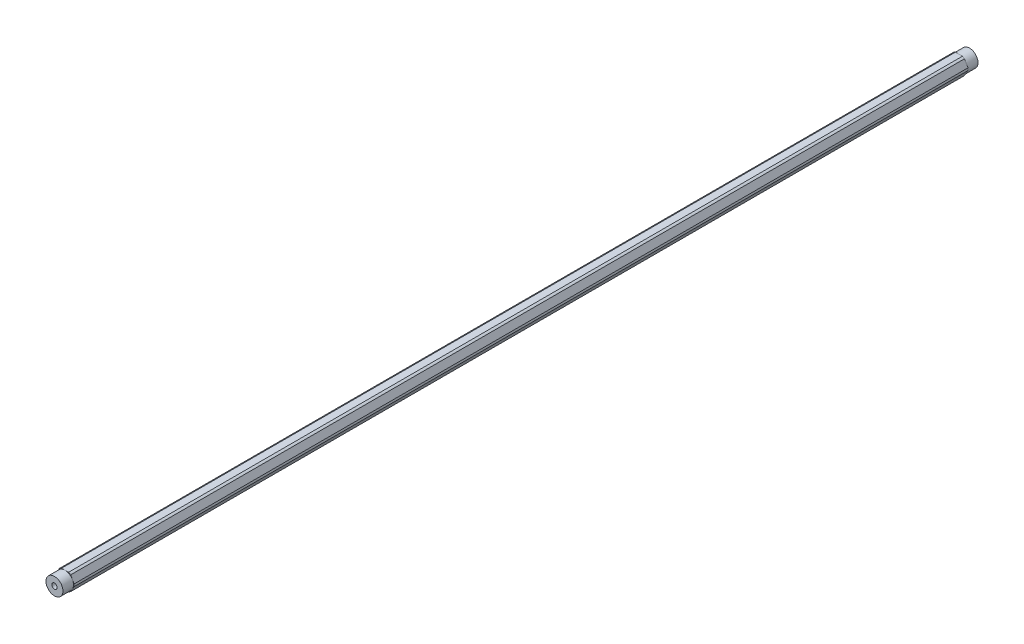
ISO-10303-21;
HEADER;
FILE_DESCRIPTION(('STEP AP214'),'2;1');
FILE_NAME('part.step','',(''),(''),'','','');
FILE_SCHEMA(('AUTOMOTIVE_DESIGN { 1 0 10303 214 1 1 1 1 }'));
ENDSEC;
DATA;
#1=APPLICATION_CONTEXT('core data for automotive mechanical design processes');
#2=APPLICATION_PROTOCOL_DEFINITION('international standard','automotive_design',2000,#1);
#3=PRODUCT_CONTEXT('',#1,'mechanical');
#4=PRODUCT('Part','Part','',(#3));
#5=PRODUCT_RELATED_PRODUCT_CATEGORY('part','',(#4));
#6=PRODUCT_DEFINITION_FORMATION('','',#4);
#7=PRODUCT_DEFINITION_CONTEXT('part definition',#1,'design');
#8=PRODUCT_DEFINITION('design','',#6,#7);
#9=PRODUCT_DEFINITION_SHAPE('','',#8);
#10=(LENGTH_UNIT() NAMED_UNIT(*) SI_UNIT(.MILLI.,.METRE.));
#11=(NAMED_UNIT(*) PLANE_ANGLE_UNIT() SI_UNIT($,.RADIAN.));
#12=(NAMED_UNIT(*) SI_UNIT($,.STERADIAN.) SOLID_ANGLE_UNIT());
#13=UNCERTAINTY_MEASURE_WITH_UNIT(LENGTH_MEASURE(1.E-05),#10,'distance_accuracy_value','');
#14=(GEOMETRIC_REPRESENTATION_CONTEXT(3) GLOBAL_UNCERTAINTY_ASSIGNED_CONTEXT((#13)) GLOBAL_UNIT_ASSIGNED_CONTEXT((#10,
#11,#12)) REPRESENTATION_CONTEXT('',''));
#15=CARTESIAN_POINT('',(0.,0.,0.));
#16=DIRECTION('',(0.,0.,1.));
#17=DIRECTION('',(1.,0.,0.));
#18=AXIS2_PLACEMENT_3D('',#15,#16,#17);
#19=CARTESIAN_POINT('',(3.66617420935409,6.34999999999998,342.9));
#20=DIRECTION('',(0.,-1.,0.));
#21=DIRECTION('',(1.,0.,0.));
#22=AXIS2_PLACEMENT_3D('',#19,#20,#21);
#23=PLANE('',#22);
#24=DIRECTION('',(1.,0.,0.));
#25=VECTOR('',#24,1.);
#26=CARTESIAN_POINT('',(3.66617420935409,6.34999999999998,-334.9498));
#27=LINE('',#26,#25);
#28=CARTESIAN_POINT('',(-2.63498102459971,6.34999999999996,-334.9498));
#29=VERTEX_POINT('',#28);
#30=CARTESIAN_POINT('',(0.,6.34999999999997,-334.9498));
#31=VERTEX_POINT('',#30);
#32=EDGE_CURVE('E215',#29,#31,#27,.T.);
#33=ORIENTED_EDGE('',*,*,#32,.F.);
#34=DIRECTION('',(0.,0.,1.));
#35=VECTOR('',#34,1.);
#36=CARTESIAN_POINT('',(-2.63498102459971,6.34999999999996,-342.9));
#37=LINE('',#36,#35);
#38=CARTESIAN_POINT('',(-2.63498102459971,6.34999999999996,334.9498));
#39=VERTEX_POINT('',#38);
#40=EDGE_CURVE('E293',#39,#29,#37,.F.);
#41=ORIENTED_EDGE('',*,*,#40,.F.);
#42=DIRECTION('',(-1.,0.,0.));
#43=VECTOR('',#42,1.);
#44=CARTESIAN_POINT('',(3.66617420935409,6.34999999999998,334.9498));
#45=LINE('',#44,#43);
#46=CARTESIAN_POINT('',(0.,6.34999999999997,334.9498));
#47=VERTEX_POINT('',#46);
#48=EDGE_CURVE('E331',#47,#39,#45,.T.);
#49=ORIENTED_EDGE('',*,*,#48,.F.);
#50=CARTESIAN_POINT('',(2.63498102459967,6.34999999999997,334.9498));
#51=VERTEX_POINT('',#50);
#52=EDGE_CURVE('E335',#51,#47,#45,.T.);
#53=ORIENTED_EDGE('',*,*,#52,.F.);
#54=DIRECTION('',(0.,0.,1.));
#55=VECTOR('',#54,1.);
#56=CARTESIAN_POINT('',(2.63498102459967,6.34999999999997,-342.9));
#57=LINE('',#56,#55);
#58=CARTESIAN_POINT('',(2.63498102459967,6.34999999999997,-334.9498));
#59=VERTEX_POINT('',#58);
#60=EDGE_CURVE('E68',#59,#51,#57,.T.);
#61=ORIENTED_EDGE('',*,*,#60,.F.);
#62=EDGE_CURVE('E62',#31,#59,#27,.T.);
#63=ORIENTED_EDGE('',*,*,#62,.F.);
#64=EDGE_LOOP('',(#33,#41,#49,#53,#61,#63));
#65=FACE_BOUND('',#64,.T.);
#66=ADVANCED_FACE('F47',(#65),#23,.F.);
#67=CARTESIAN_POINT('',(-3.66617420935414,6.34999999999995,342.9));
#68=DIRECTION('',(0.866025403784442,-0.499999999999995,0.));
#69=DIRECTION('',(0.499999999999995,0.866025403784442,0.));
#70=AXIS2_PLACEMENT_3D('',#67,#68,#69);
#71=PLANE('',#70);
#72=DIRECTION('',(0.499999999999995,0.866025403784442,0.));
#73=VECTOR('',#72,1.);
#74=CARTESIAN_POINT('',(-3.66617420935414,6.34999999999995,-334.9498));
#75=LINE('',#74,#73);
#76=CARTESIAN_POINT('',(-6.81675182633101,0.893039494206661,-334.9498));
#77=VERTEX_POINT('',#76);
#78=CARTESIAN_POINT('',(-5.49926131403117,3.17499999999995,-334.9498));
#79=VERTEX_POINT('',#78);
#80=EDGE_CURVE('E212',#77,#79,#75,.T.);
#81=ORIENTED_EDGE('',*,*,#80,.F.);
#82=DIRECTION('',(0.,0.,1.));
#83=VECTOR('',#82,1.);
#84=CARTESIAN_POINT('',(-6.81675182633101,0.89303949420666,-342.9));
#85=LINE('',#84,#83);
#86=CARTESIAN_POINT('',(-6.81675182633101,0.89303949420666,334.9498));
#87=VERTEX_POINT('',#86);
#88=EDGE_CURVE('E282',#87,#77,#85,.F.);
#89=ORIENTED_EDGE('',*,*,#88,.F.);
#90=DIRECTION('',(-0.499999999999995,-0.866025403784442,0.));
#91=VECTOR('',#90,1.);
#92=CARTESIAN_POINT('',(-3.66617420935414,6.34999999999995,334.9498));
#93=LINE('',#92,#91);
#94=CARTESIAN_POINT('',(-5.49926131403117,3.17499999999995,334.9498));
#95=VERTEX_POINT('',#94);
#96=EDGE_CURVE('E326',#95,#87,#93,.T.);
#97=ORIENTED_EDGE('',*,*,#96,.F.);
#98=CARTESIAN_POINT('',(-4.18177080173134,5.45696050579324,334.9498));
#99=VERTEX_POINT('',#98);
#100=EDGE_CURVE('E330',#99,#95,#93,.T.);
#101=ORIENTED_EDGE('',*,*,#100,.F.);
#102=DIRECTION('',(0.,0.,1.));
#103=VECTOR('',#102,1.);
#104=CARTESIAN_POINT('',(-4.18177080173134,5.45696050579324,-342.9));
#105=LINE('',#104,#103);
#106=CARTESIAN_POINT('',(-4.18177080173134,5.45696050579324,-334.9498));
#107=VERTEX_POINT('',#106);
#108=EDGE_CURVE('E290',#107,#99,#105,.T.);
#109=ORIENTED_EDGE('',*,*,#108,.F.);
#110=EDGE_CURVE('E208',#79,#107,#75,.T.);
#111=ORIENTED_EDGE('',*,*,#110,.F.);
#112=EDGE_LOOP('',(#81,#89,#97,#101,#109,#111));
#113=FACE_BOUND('',#112,.T.);
#114=ADVANCED_FACE('F404',(#113),#71,.F.);
#115=CARTESIAN_POINT('',(-7.33234841870821,0.,342.9));
#116=DIRECTION('',(0.866025403784434,0.500000000000007,0.));
#117=DIRECTION('',(-0.500000000000007,0.866025403784435,0.));
#118=AXIS2_PLACEMENT_3D('',#115,#116,#117);
#119=PLANE('',#118);
#120=DIRECTION('',(-0.500000000000007,0.866025403784435,0.));
#121=VECTOR('',#120,1.);
#122=CARTESIAN_POINT('',(-7.33234841870821,0.,-334.9498));
#123=LINE('',#122,#121);
#124=CARTESIAN_POINT('',(-4.18177080173127,-5.4569605057933,-334.9498));
#125=VERTEX_POINT('',#124);
#126=CARTESIAN_POINT('',(-5.49926131403113,-3.17500000000003,-334.9498));
#127=VERTEX_POINT('',#126);
#128=EDGE_CURVE('E234',#125,#127,#123,.T.);
#129=ORIENTED_EDGE('',*,*,#128,.F.);
#130=DIRECTION('',(0.,0.,1.));
#131=VECTOR('',#130,1.);
#132=CARTESIAN_POINT('',(-4.18177080173126,-5.4569605057933,-342.9));
#133=LINE('',#132,#131);
#134=CARTESIAN_POINT('',(-4.18177080173127,-5.4569605057933,334.9498));
#135=VERTEX_POINT('',#134);
#136=EDGE_CURVE('E271',#135,#125,#133,.F.);
#137=ORIENTED_EDGE('',*,*,#136,.F.);
#138=DIRECTION('',(0.500000000000007,-0.866025403784435,0.));
#139=VECTOR('',#138,1.);
#140=CARTESIAN_POINT('',(-7.33234841870821,0.,334.9498));
#141=LINE('',#140,#139);
#142=CARTESIAN_POINT('',(-5.49926131403113,-3.17500000000003,334.9498));
#143=VERTEX_POINT('',#142);
#144=EDGE_CURVE('E321',#143,#135,#141,.T.);
#145=ORIENTED_EDGE('',*,*,#144,.F.);
#146=CARTESIAN_POINT('',(-6.81675182633099,-0.893039494206761,334.9498));
#147=VERTEX_POINT('',#146);
#148=EDGE_CURVE('E325',#147,#143,#141,.T.);
#149=ORIENTED_EDGE('',*,*,#148,.F.);
#150=DIRECTION('',(0.,0.,1.));
#151=VECTOR('',#150,1.);
#152=CARTESIAN_POINT('',(-6.81675182633099,-0.893039494206754,-342.9));
#153=LINE('',#152,#151);
#154=CARTESIAN_POINT('',(-6.81675182633099,-0.893039494206759,-334.9498));
#155=VERTEX_POINT('',#154);
#156=EDGE_CURVE('E279',#155,#147,#153,.T.);
#157=ORIENTED_EDGE('',*,*,#156,.F.);
#158=EDGE_CURVE('E230',#127,#155,#123,.T.);
#159=ORIENTED_EDGE('',*,*,#158,.F.);
#160=EDGE_LOOP('',(#129,#137,#145,#149,#157,#159));
#161=FACE_BOUND('',#160,.T.);
#162=ADVANCED_FACE('F456',(#161),#119,.F.);
#163=CARTESIAN_POINT('',(-3.66617420935405,-6.35,342.9));
#164=DIRECTION('',(0.,1.,0.));
#165=DIRECTION('',(-1.,0.,0.));
#166=AXIS2_PLACEMENT_3D('',#163,#164,#165);
#167=PLANE('',#166);
#168=DIRECTION('',(-1.,0.,0.));
#169=VECTOR('',#168,1.);
#170=CARTESIAN_POINT('',(-3.66617420935405,-6.35,-334.9498));
#171=LINE('',#170,#169);
#172=CARTESIAN_POINT('',(2.63498102459976,-6.34999999999994,-334.9498));
#173=VERTEX_POINT('',#172);
#174=CARTESIAN_POINT('',(0.,-6.34999999999997,-334.9498));
#175=VERTEX_POINT('',#174);
#176=EDGE_CURVE('E242',#173,#175,#171,.T.);
#177=ORIENTED_EDGE('',*,*,#176,.F.);
#178=DIRECTION('',(0.,0.,1.));
#179=VECTOR('',#178,1.);
#180=CARTESIAN_POINT('',(2.63498102459976,-6.34999999999994,-342.9));
#181=LINE('',#180,#179);
#182=CARTESIAN_POINT('',(2.63498102459976,-6.34999999999994,334.9498));
#183=VERTEX_POINT('',#182);
#184=EDGE_CURVE('E260',#183,#173,#181,.F.);
#185=ORIENTED_EDGE('',*,*,#184,.F.);
#186=DIRECTION('',(1.,0.,0.));
#187=VECTOR('',#186,1.);
#188=CARTESIAN_POINT('',(-3.66617420935405,-6.35,334.9498));
#189=LINE('',#188,#187);
#190=CARTESIAN_POINT('',(0.,-6.34999999999997,334.9498));
#191=VERTEX_POINT('',#190);
#192=EDGE_CURVE('E316',#191,#183,#189,.T.);
#193=ORIENTED_EDGE('',*,*,#192,.F.);
#194=CARTESIAN_POINT('',(-2.63498102459963,-6.34999999999999,334.9498));
#195=VERTEX_POINT('',#194);
#196=EDGE_CURVE('E320',#195,#191,#189,.T.);
#197=ORIENTED_EDGE('',*,*,#196,.F.);
#198=DIRECTION('',(0.,0.,1.));
#199=VECTOR('',#198,1.);
#200=CARTESIAN_POINT('',(-2.63498102459963,-6.34999999999999,-342.9));
#201=LINE('',#200,#199);
#202=CARTESIAN_POINT('',(-2.63498102459963,-6.34999999999999,-334.9498));
#203=VERTEX_POINT('',#202);
#204=EDGE_CURVE('E268',#203,#195,#201,.T.);
#205=ORIENTED_EDGE('',*,*,#204,.F.);
#206=EDGE_CURVE('E239',#175,#203,#171,.T.);
#207=ORIENTED_EDGE('',*,*,#206,.F.);
#208=EDGE_LOOP('',(#177,#185,#193,#197,#205,#207));
#209=FACE_BOUND('',#208,.T.);
#210=ADVANCED_FACE('F426',(#209),#167,.F.);
#211=CARTESIAN_POINT('',(3.66617420935418,-6.34999999999993,342.9));
#212=DIRECTION('',(-0.866025403784441,0.499999999999995,0.));
#213=DIRECTION('',(-0.499999999999995,-0.866025403784441,0.));
#214=AXIS2_PLACEMENT_3D('',#211,#212,#213);
#215=PLANE('',#214);
#216=DIRECTION('',(-0.499999999999995,-0.866025403784441,0.));
#217=VECTOR('',#216,1.);
#218=CARTESIAN_POINT('',(3.66617420935418,-6.34999999999993,-334.9498));
#219=LINE('',#218,#217);
#220=CARTESIAN_POINT('',(6.816751826331,-0.893039494206728,-334.9498));
#221=VERTEX_POINT('',#220);
#222=CARTESIAN_POINT('',(5.49926131403117,-3.17499999999995,-334.9498));
#223=VERTEX_POINT('',#222);
#224=EDGE_CURVE('E188',#221,#223,#219,.T.);
#225=ORIENTED_EDGE('',*,*,#224,.F.);
#226=DIRECTION('',(0.,0.,1.));
#227=VECTOR('',#226,1.);
#228=CARTESIAN_POINT('',(6.816751826331,-0.893039494206728,-342.9));
#229=LINE('',#228,#227);
#230=CARTESIAN_POINT('',(6.816751826331,-0.893039494206728,334.9498));
#231=VERTEX_POINT('',#230);
#232=EDGE_CURVE('E249',#231,#221,#229,.F.);
#233=ORIENTED_EDGE('',*,*,#232,.F.);
#234=DIRECTION('',(0.499999999999995,0.866025403784441,0.));
#235=VECTOR('',#234,1.);
#236=CARTESIAN_POINT('',(3.66617420935418,-6.34999999999993,334.9498));
#237=LINE('',#236,#235);
#238=CARTESIAN_POINT('',(5.49926131403117,-3.17499999999995,334.9498));
#239=VERTEX_POINT('',#238);
#240=EDGE_CURVE('E310',#239,#231,#237,.T.);
#241=ORIENTED_EDGE('',*,*,#240,.F.);
#242=CARTESIAN_POINT('',(4.18177080173139,-5.4569605057932,334.9498));
#243=VERTEX_POINT('',#242);
#244=EDGE_CURVE('E315',#243,#239,#237,.T.);
#245=ORIENTED_EDGE('',*,*,#244,.F.);
#246=DIRECTION('',(0.,0.,1.));
#247=VECTOR('',#246,1.);
#248=CARTESIAN_POINT('',(4.18177080173139,-5.4569605057932,-342.9));
#249=LINE('',#248,#247);
#250=CARTESIAN_POINT('',(4.18177080173139,-5.4569605057932,-334.9498));
#251=VERTEX_POINT('',#250);
#252=EDGE_CURVE('E257',#251,#243,#249,.T.);
#253=ORIENTED_EDGE('',*,*,#252,.F.);
#254=EDGE_CURVE('E231',#223,#251,#219,.T.);
#255=ORIENTED_EDGE('',*,*,#254,.F.);
#256=EDGE_LOOP('',(#225,#233,#241,#245,#253,#255));
#257=FACE_BOUND('',#256,.T.);
#258=ADVANCED_FACE('F433',(#257),#215,.F.);
#259=CARTESIAN_POINT('',(7.33234841870821,0.,342.9));
#260=DIRECTION('',(-0.866025403784438,-0.500000000000001,0.));
#261=DIRECTION('',(0.500000000000001,-0.866025403784438,0.));
#262=AXIS2_PLACEMENT_3D('',#259,#260,#261);
#263=PLANE('',#262);
#264=DIRECTION('',(0.500000000000001,-0.866025403784438,0.));
#265=VECTOR('',#264,1.);
#266=CARTESIAN_POINT('',(7.33234841870821,0.,-334.9498));
#267=LINE('',#266,#265);
#268=CARTESIAN_POINT('',(4.1817708017313,5.45696050579327,-334.9498));
#269=VERTEX_POINT('',#268);
#270=CARTESIAN_POINT('',(5.49926131403115,3.17499999999999,-334.9498));
#271=VERTEX_POINT('',#270);
#272=EDGE_CURVE('E170',#269,#271,#267,.T.);
#273=ORIENTED_EDGE('',*,*,#272,.F.);
#274=DIRECTION('',(0.,0.,1.));
#275=VECTOR('',#274,1.);
#276=CARTESIAN_POINT('',(4.1817708017313,5.45696050579327,-342.9));
#277=LINE('',#276,#275);
#278=CARTESIAN_POINT('',(4.18177080173131,5.45696050579327,334.9498));
#279=VERTEX_POINT('',#278);
#280=EDGE_CURVE('E300',#279,#269,#277,.F.);
#281=ORIENTED_EDGE('',*,*,#280,.F.);
#282=DIRECTION('',(-0.500000000000001,0.866025403784438,0.));
#283=VECTOR('',#282,1.);
#284=CARTESIAN_POINT('',(7.33234841870821,0.,334.9498));
#285=LINE('',#284,#283);
#286=CARTESIAN_POINT('',(5.49926131403115,3.17499999999999,334.9498));
#287=VERTEX_POINT('',#286);
#288=EDGE_CURVE('E340',#287,#279,#285,.T.);
#289=ORIENTED_EDGE('',*,*,#288,.F.);
#290=CARTESIAN_POINT('',(6.816751826331,0.893039494206714,334.9498));
#291=VERTEX_POINT('',#290);
#292=EDGE_CURVE('E343',#291,#287,#285,.T.);
#293=ORIENTED_EDGE('',*,*,#292,.F.);
#294=DIRECTION('',(0.,0.,1.));
#295=VECTOR('',#294,1.);
#296=CARTESIAN_POINT('',(6.816751826331,0.89303949420671,-342.9));
#297=LINE('',#296,#295);
#298=CARTESIAN_POINT('',(6.816751826331,0.89303949420671,-334.9498));
#299=VERTEX_POINT('',#298);
#300=EDGE_CURVE('E206',#299,#291,#297,.T.);
#301=ORIENTED_EDGE('',*,*,#300,.F.);
#302=EDGE_CURVE('E181',#271,#299,#267,.T.);
#303=ORIENTED_EDGE('',*,*,#302,.F.);
#304=EDGE_LOOP('',(#273,#281,#289,#293,#301,#303));
#305=FACE_BOUND('',#304,.T.);
#306=ADVANCED_FACE('F204',(#305),#263,.F.);
#307=CARTESIAN_POINT('',(0.,0.,-342.9));
#308=DIRECTION('',(0.,0.,1.));
#309=DIRECTION('',(1.,0.,0.));
#310=AXIS2_PLACEMENT_3D('',#307,#308,#309);
#311=CYLINDRICAL_SURFACE('',#310,6.875);
#312=ORIENTED_EDGE('',*,*,#232,.T.);
#313=CARTESIAN_POINT('',(0.,0.,-334.9498));
#314=DIRECTION('',(0.,0.,-1.));
#315=DIRECTION('',(-1.,0.,0.));
#316=AXIS2_PLACEMENT_3D('',#313,#314,#315);
#317=CIRCLE('',#316,6.875);
#318=EDGE_CURVE('E225',#221,#299,#317,.F.);
#319=ORIENTED_EDGE('',*,*,#318,.T.);
#320=ORIENTED_EDGE('',*,*,#300,.T.);
#321=CARTESIAN_POINT('',(0.,0.,334.9498));
#322=DIRECTION('',(0.,0.,1.));
#323=DIRECTION('',(1.,0.,0.));
#324=AXIS2_PLACEMENT_3D('',#321,#322,#323);
#325=CIRCLE('',#324,6.875);
#326=EDGE_CURVE('E55',#231,#291,#325,.T.);
#327=ORIENTED_EDGE('',*,*,#326,.F.);
#328=EDGE_LOOP('',(#312,#319,#320,#327));
#329=FACE_BOUND('',#328,.T.);
#330=ADVANCED_FACE('F437',(#329),#311,.T.);
#331=ORIENTED_EDGE('',*,*,#184,.T.);
#332=CARTESIAN_POINT('',(0.,0.,-334.9498));
#333=DIRECTION('',(0.,0.,-1.));
#334=DIRECTION('',(-1.,0.,0.));
#335=AXIS2_PLACEMENT_3D('',#332,#333,#334);
#336=CIRCLE('',#335,6.875);
#337=EDGE_CURVE('E243',#173,#251,#336,.F.);
#338=ORIENTED_EDGE('',*,*,#337,.T.);
#339=ORIENTED_EDGE('',*,*,#252,.T.);
#340=CARTESIAN_POINT('',(0.,0.,334.9498));
#341=DIRECTION('',(0.,0.,1.));
#342=DIRECTION('',(1.,0.,0.));
#343=AXIS2_PLACEMENT_3D('',#340,#341,#342);
#344=CIRCLE('',#343,6.875);
#345=EDGE_CURVE('E253',#183,#243,#344,.T.);
#346=ORIENTED_EDGE('',*,*,#345,.F.);
#347=EDGE_LOOP('',(#331,#338,#339,#346));
#348=FACE_BOUND('',#347,.T.);
#349=ADVANCED_FACE('F439',(#348),#311,.T.);
#350=ORIENTED_EDGE('',*,*,#136,.T.);
#351=CARTESIAN_POINT('',(0.,0.,-334.9498));
#352=DIRECTION('',(0.,0.,-1.));
#353=DIRECTION('',(-1.,0.,0.));
#354=AXIS2_PLACEMENT_3D('',#351,#352,#353);
#355=CIRCLE('',#354,6.875);
#356=EDGE_CURVE('E235',#125,#203,#355,.F.);
#357=ORIENTED_EDGE('',*,*,#356,.T.);
#358=ORIENTED_EDGE('',*,*,#204,.T.);
#359=CARTESIAN_POINT('',(0.,0.,334.9498));
#360=DIRECTION('',(0.,0.,1.));
#361=DIRECTION('',(1.,0.,0.));
#362=AXIS2_PLACEMENT_3D('',#359,#360,#361);
#363=CIRCLE('',#362,6.875);
#364=EDGE_CURVE('E264',#135,#195,#363,.T.);
#365=ORIENTED_EDGE('',*,*,#364,.F.);
#366=EDGE_LOOP('',(#350,#357,#358,#365));
#367=FACE_BOUND('',#366,.T.);
#368=ADVANCED_FACE('F445',(#367),#311,.T.);
#369=ORIENTED_EDGE('',*,*,#88,.T.);
#370=CARTESIAN_POINT('',(0.,0.,-334.9498));
#371=DIRECTION('',(0.,0.,-1.));
#372=DIRECTION('',(-1.,0.,0.));
#373=AXIS2_PLACEMENT_3D('',#370,#371,#372);
#374=CIRCLE('',#373,6.875);
#375=EDGE_CURVE('E221',#77,#155,#374,.F.);
#376=ORIENTED_EDGE('',*,*,#375,.T.);
#377=ORIENTED_EDGE('',*,*,#156,.T.);
#378=CARTESIAN_POINT('',(0.,0.,334.9498));
#379=DIRECTION('',(0.,0.,1.));
#380=DIRECTION('',(1.,0.,0.));
#381=AXIS2_PLACEMENT_3D('',#378,#379,#380);
#382=CIRCLE('',#381,6.875);
#383=EDGE_CURVE('E275',#87,#147,#382,.T.);
#384=ORIENTED_EDGE('',*,*,#383,.F.);
#385=EDGE_LOOP('',(#369,#376,#377,#384));
#386=FACE_BOUND('',#385,.T.);
#387=ADVANCED_FACE('F517',(#386),#311,.T.);
#388=ORIENTED_EDGE('',*,*,#40,.T.);
#389=CARTESIAN_POINT('',(0.,0.,-334.9498));
#390=DIRECTION('',(0.,0.,-1.));
#391=DIRECTION('',(-1.,0.,0.));
#392=AXIS2_PLACEMENT_3D('',#389,#390,#391);
#393=CIRCLE('',#392,6.875);
#394=EDGE_CURVE('E209',#29,#107,#393,.F.);
#395=ORIENTED_EDGE('',*,*,#394,.T.);
#396=ORIENTED_EDGE('',*,*,#108,.T.);
#397=CARTESIAN_POINT('',(0.,0.,334.9498));
#398=DIRECTION('',(0.,0.,1.));
#399=DIRECTION('',(1.,0.,0.));
#400=AXIS2_PLACEMENT_3D('',#397,#398,#399);
#401=CIRCLE('',#400,6.875);
#402=EDGE_CURVE('E286',#39,#99,#401,.T.);
#403=ORIENTED_EDGE('',*,*,#402,.F.);
#404=EDGE_LOOP('',(#388,#395,#396,#403));
#405=FACE_BOUND('',#404,.T.);
#406=ADVANCED_FACE('F408',(#405),#311,.T.);
#407=ORIENTED_EDGE('',*,*,#280,.T.);
#408=CARTESIAN_POINT('',(0.,0.,-334.9498));
#409=DIRECTION('',(0.,0.,-1.));
#410=DIRECTION('',(-1.,0.,0.));
#411=AXIS2_PLACEMENT_3D('',#408,#409,#410);
#412=CIRCLE('',#411,6.875);
#413=EDGE_CURVE('E12',#269,#59,#412,.F.);
#414=ORIENTED_EDGE('',*,*,#413,.T.);
#415=ORIENTED_EDGE('',*,*,#60,.T.);
#416=CARTESIAN_POINT('',(0.,0.,334.9498));
#417=DIRECTION('',(0.,0.,1.));
#418=DIRECTION('',(1.,0.,0.));
#419=AXIS2_PLACEMENT_3D('',#416,#417,#418);
#420=CIRCLE('',#419,6.875);
#421=EDGE_CURVE('E297',#279,#51,#420,.T.);
#422=ORIENTED_EDGE('',*,*,#421,.F.);
#423=EDGE_LOOP('',(#407,#414,#415,#422));
#424=FACE_BOUND('',#423,.T.);
#425=ADVANCED_FACE('F367',(#424),#311,.T.);
#426=CARTESIAN_POINT('',(0.,0.,334.9498));
#427=DIRECTION('',(0.,0.,1.));
#428=DIRECTION('',(1.,0.,0.));
#429=AXIS2_PLACEMENT_3D('',#426,#427,#428);
#430=PLANE('',#429);
#431=ORIENTED_EDGE('',*,*,#288,.T.);
#432=ORIENTED_EDGE('',*,*,#421,.T.);
#433=ORIENTED_EDGE('',*,*,#52,.T.);
#434=CARTESIAN_POINT('',(0.,0.,334.9498));
#435=DIRECTION('',(0.,0.,1.));
#436=DIRECTION('',(1.,0.,0.));
#437=AXIS2_PLACEMENT_3D('',#434,#435,#436);
#438=CIRCLE('',#437,6.34999999999997);
#439=EDGE_CURVE('E306',#287,#47,#438,.T.);
#440=ORIENTED_EDGE('',*,*,#439,.F.);
#441=EDGE_LOOP('',(#431,#432,#433,#440));
#442=FACE_BOUND('',#441,.T.);
#443=ADVANCED_FACE('F355',(#442),#430,.T.);
#444=ORIENTED_EDGE('',*,*,#48,.T.);
#445=ORIENTED_EDGE('',*,*,#402,.T.);
#446=ORIENTED_EDGE('',*,*,#100,.T.);
#447=EDGE_CURVE('E311',#47,#95,#438,.T.);
#448=ORIENTED_EDGE('',*,*,#447,.F.);
#449=EDGE_LOOP('',(#444,#445,#446,#448));
#450=FACE_BOUND('',#449,.T.);
#451=ADVANCED_FACE('F410',(#450),#430,.T.);
#452=ORIENTED_EDGE('',*,*,#96,.T.);
#453=ORIENTED_EDGE('',*,*,#383,.T.);
#454=ORIENTED_EDGE('',*,*,#148,.T.);
#455=EDGE_CURVE('E378',#95,#143,#438,.T.);
#456=ORIENTED_EDGE('',*,*,#455,.F.);
#457=EDGE_LOOP('',(#452,#453,#454,#456));
#458=FACE_BOUND('',#457,.T.);
#459=ADVANCED_FACE('F414',(#458),#430,.T.);
#460=ORIENTED_EDGE('',*,*,#144,.T.);
#461=ORIENTED_EDGE('',*,*,#364,.T.);
#462=ORIENTED_EDGE('',*,*,#196,.T.);
#463=EDGE_CURVE('E381',#143,#191,#438,.T.);
#464=ORIENTED_EDGE('',*,*,#463,.F.);
#465=EDGE_LOOP('',(#460,#461,#462,#464));
#466=FACE_BOUND('',#465,.T.);
#467=ADVANCED_FACE('F420',(#466),#430,.T.);
#468=ORIENTED_EDGE('',*,*,#192,.T.);
#469=ORIENTED_EDGE('',*,*,#345,.T.);
#470=ORIENTED_EDGE('',*,*,#244,.T.);
#471=EDGE_CURVE('E364',#191,#239,#438,.T.);
#472=ORIENTED_EDGE('',*,*,#471,.F.);
#473=EDGE_LOOP('',(#468,#469,#470,#472));
#474=FACE_BOUND('',#473,.T.);
#475=ADVANCED_FACE('F429',(#474),#430,.T.);
#476=ORIENTED_EDGE('',*,*,#240,.T.);
#477=ORIENTED_EDGE('',*,*,#326,.T.);
#478=ORIENTED_EDGE('',*,*,#292,.T.);
#479=EDGE_CURVE('E305',#239,#287,#438,.T.);
#480=ORIENTED_EDGE('',*,*,#479,.F.);
#481=EDGE_LOOP('',(#476,#477,#478,#480));
#482=FACE_BOUND('',#481,.T.);
#483=ADVANCED_FACE('F350',(#482),#430,.T.);
#484=CARTESIAN_POINT('',(0.,0.,334.9498));
#485=DIRECTION('',(0.,0.,1.));
#486=DIRECTION('',(1.,0.,0.));
#487=AXIS2_PLACEMENT_3D('',#484,#485,#486);
#488=CYLINDRICAL_SURFACE('',#487,6.34999999999997);
#489=CARTESIAN_POINT('',(0.,0.,342.9));
#490=DIRECTION('',(0.,0.,1.));
#491=DIRECTION('',(1.,0.,0.));
#492=AXIS2_PLACEMENT_3D('',#489,#490,#491);
#493=CIRCLE('',#492,6.34999999999997);
#494=CARTESIAN_POINT('',(6.34999999999997,0.,342.9));
#495=VERTEX_POINT('',#494);
#496=EDGE_CURVE('E336',#495,#495,#493,.T.);
#497=ORIENTED_EDGE('',*,*,#496,.F.);
#498=EDGE_LOOP('',(#497));
#499=FACE_BOUND('',#498,.T.);
#500=ORIENTED_EDGE('',*,*,#439,.T.);
#501=ORIENTED_EDGE('',*,*,#447,.T.);
#502=ORIENTED_EDGE('',*,*,#455,.T.);
#503=ORIENTED_EDGE('',*,*,#463,.T.);
#504=ORIENTED_EDGE('',*,*,#471,.T.);
#505=ORIENTED_EDGE('',*,*,#479,.T.);
#506=EDGE_LOOP('',(#500,#501,#502,#503,#504,#505));
#507=FACE_BOUND('',#506,.T.);
#508=ADVANCED_FACE('F361',(#499,#507),#488,.T.);
#509=CARTESIAN_POINT('',(0.,0.,342.9));
#510=DIRECTION('',(0.,0.,1.));
#511=DIRECTION('',(1.,0.,0.));
#512=AXIS2_PLACEMENT_3D('',#509,#510,#511);
#513=PLANE('',#512);
#514=CARTESIAN_POINT('',(0.,0.,342.9));
#515=DIRECTION('',(0.,0.,1.));
#516=DIRECTION('',(1.,0.,0.));
#517=AXIS2_PLACEMENT_3D('',#514,#515,#516);
#518=CIRCLE('',#517,2.0193);
#519=CARTESIAN_POINT('',(2.0193,0.,342.9));
#520=VERTEX_POINT('',#519);
#521=EDGE_CURVE('E675',#520,#520,#518,.T.);
#522=ORIENTED_EDGE('',*,*,#521,.F.);
#523=EDGE_LOOP('',(#522));
#524=FACE_BOUND('',#523,.T.);
#525=ORIENTED_EDGE('',*,*,#496,.T.);
#526=EDGE_LOOP('',(#525));
#527=FACE_BOUND('',#526,.T.);
#528=ADVANCED_FACE('F472',(#524,#527),#513,.T.);
#529=CARTESIAN_POINT('',(0.,0.,-334.9498));
#530=DIRECTION('',(0.,0.,-1.));
#531=DIRECTION('',(-1.,0.,0.));
#532=AXIS2_PLACEMENT_3D('',#529,#530,#531);
#533=CYLINDRICAL_SURFACE('',#532,6.34999999999997);
#534=CARTESIAN_POINT('',(0.,0.,-334.9498));
#535=DIRECTION('',(0.,0.,1.));
#536=DIRECTION('',(1.,0.,0.));
#537=AXIS2_PLACEMENT_3D('',#534,#535,#536);
#538=CIRCLE('',#537,6.34999999999997);
#539=EDGE_CURVE('E201',#31,#79,#538,.T.);
#540=ORIENTED_EDGE('',*,*,#539,.F.);
#541=EDGE_CURVE('E174',#271,#31,#538,.T.);
#542=ORIENTED_EDGE('',*,*,#541,.F.);
#543=EDGE_CURVE('E184',#223,#271,#538,.T.);
#544=ORIENTED_EDGE('',*,*,#543,.F.);
#545=EDGE_CURVE('E193',#175,#223,#538,.T.);
#546=ORIENTED_EDGE('',*,*,#545,.F.);
#547=EDGE_CURVE('E398',#127,#175,#538,.T.);
#548=ORIENTED_EDGE('',*,*,#547,.F.);
#549=EDGE_CURVE('E391',#79,#127,#538,.T.);
#550=ORIENTED_EDGE('',*,*,#549,.F.);
#551=EDGE_LOOP('',(#540,#542,#544,#546,#548,#550));
#552=FACE_BOUND('',#551,.T.);
#553=CARTESIAN_POINT('',(0.,0.,-342.9));
#554=DIRECTION('',(0.,0.,1.));
#555=DIRECTION('',(1.,0.,0.));
#556=AXIS2_PLACEMENT_3D('',#553,#554,#555);
#557=CIRCLE('',#556,6.34999999999997);
#558=CARTESIAN_POINT('',(6.34999999999997,0.,-342.9));
#559=VERTEX_POINT('',#558);
#560=EDGE_CURVE('E194',#559,#559,#557,.T.);
#561=ORIENTED_EDGE('',*,*,#560,.T.);
#562=EDGE_LOOP('',(#561));
#563=FACE_BOUND('',#562,.T.);
#564=ADVANCED_FACE('F197',(#552,#563),#533,.T.);
#565=CARTESIAN_POINT('',(0.,0.,-334.9498));
#566=DIRECTION('',(0.,0.,-1.));
#567=DIRECTION('',(-1.,0.,0.));
#568=AXIS2_PLACEMENT_3D('',#565,#566,#567);
#569=PLANE('',#568);
#570=ORIENTED_EDGE('',*,*,#206,.T.);
#571=ORIENTED_EDGE('',*,*,#356,.F.);
#572=ORIENTED_EDGE('',*,*,#128,.T.);
#573=ORIENTED_EDGE('',*,*,#547,.T.);
#574=EDGE_LOOP('',(#570,#571,#572,#573));
#575=FACE_BOUND('',#574,.T.);
#576=ADVANCED_FACE('F583',(#575),#569,.T.);
#577=ORIENTED_EDGE('',*,*,#158,.T.);
#578=ORIENTED_EDGE('',*,*,#375,.F.);
#579=ORIENTED_EDGE('',*,*,#80,.T.);
#580=ORIENTED_EDGE('',*,*,#549,.T.);
#581=EDGE_LOOP('',(#577,#578,#579,#580));
#582=FACE_BOUND('',#581,.T.);
#583=ADVANCED_FACE('F390',(#582),#569,.T.);
#584=ORIENTED_EDGE('',*,*,#224,.T.);
#585=ORIENTED_EDGE('',*,*,#543,.T.);
#586=ORIENTED_EDGE('',*,*,#302,.T.);
#587=ORIENTED_EDGE('',*,*,#318,.F.);
#588=EDGE_LOOP('',(#584,#585,#586,#587));
#589=FACE_BOUND('',#588,.T.);
#590=ADVANCED_FACE('F185',(#589),#569,.T.);
#591=ORIENTED_EDGE('',*,*,#110,.T.);
#592=ORIENTED_EDGE('',*,*,#394,.F.);
#593=ORIENTED_EDGE('',*,*,#32,.T.);
#594=ORIENTED_EDGE('',*,*,#539,.T.);
#595=EDGE_LOOP('',(#591,#592,#593,#594));
#596=FACE_BOUND('',#595,.T.);
#597=ADVANCED_FACE('F401',(#596),#569,.T.);
#598=ORIENTED_EDGE('',*,*,#62,.T.);
#599=ORIENTED_EDGE('',*,*,#413,.F.);
#600=ORIENTED_EDGE('',*,*,#272,.T.);
#601=ORIENTED_EDGE('',*,*,#541,.T.);
#602=EDGE_LOOP('',(#598,#599,#600,#601));
#603=FACE_BOUND('',#602,.T.);
#604=ADVANCED_FACE('F172',(#603),#569,.T.);
#605=ORIENTED_EDGE('',*,*,#176,.T.);
#606=ORIENTED_EDGE('',*,*,#545,.T.);
#607=ORIENTED_EDGE('',*,*,#254,.T.);
#608=ORIENTED_EDGE('',*,*,#337,.F.);
#609=EDGE_LOOP('',(#605,#606,#607,#608));
#610=FACE_BOUND('',#609,.T.);
#611=ADVANCED_FACE('F470',(#610),#569,.T.);
#612=CARTESIAN_POINT('',(0.,0.,-342.9));
#613=DIRECTION('',(0.,0.,1.));
#614=DIRECTION('',(1.,0.,0.));
#615=AXIS2_PLACEMENT_3D('',#612,#613,#614);
#616=PLANE('',#615);
#617=CARTESIAN_POINT('',(0.,0.,-342.9));
#618=DIRECTION('',(0.,0.,1.));
#619=DIRECTION('',(1.,0.,0.));
#620=AXIS2_PLACEMENT_3D('',#617,#618,#619);
#621=CIRCLE('',#620,2.0193);
#622=CARTESIAN_POINT('',(2.0193,0.,-342.9));
#623=VERTEX_POINT('',#622);
#624=EDGE_CURVE('E672',#623,#623,#621,.T.);
#625=ORIENTED_EDGE('',*,*,#624,.T.);
#626=EDGE_LOOP('',(#625));
#627=FACE_BOUND('',#626,.T.);
#628=ORIENTED_EDGE('',*,*,#560,.F.);
#629=EDGE_LOOP('',(#628));
#630=FACE_BOUND('',#629,.T.);
#631=ADVANCED_FACE('F466',(#627,#630),#616,.F.);
#632=CARTESIAN_POINT('',(0.,0.,-342.9));
#633=DIRECTION('',(0.,0.,1.));
#634=DIRECTION('',(1.,0.,0.));
#635=AXIS2_PLACEMENT_3D('',#632,#633,#634);
#636=CYLINDRICAL_SURFACE('',#635,2.0193);
#637=ORIENTED_EDGE('',*,*,#624,.F.);
#638=EDGE_LOOP('',(#637));
#639=FACE_BOUND('',#638,.T.);
#640=ORIENTED_EDGE('',*,*,#521,.T.);
#641=EDGE_LOOP('',(#640));
#642=FACE_BOUND('',#641,.T.);
#643=ADVANCED_FACE('F469',(#639,#642),#636,.F.);
#644=CLOSED_SHELL('',(#66,#114,#162,#210,#258,#306,#330,#349,#368,#387,#406,#425,#443,#451,#459,
#467,#475,#483,#508,#528,#564,#576,#583,#590,#597,#604,#611,#631,#643));
#645=MANIFOLD_SOLID_BREP('B2',#644);
#646=ADVANCED_BREP_SHAPE_REPRESENTATION('',(#18,#645),#14);
#647=SHAPE_DEFINITION_REPRESENTATION(#9,#646);
ENDSEC;
END-ISO-10303-21;
